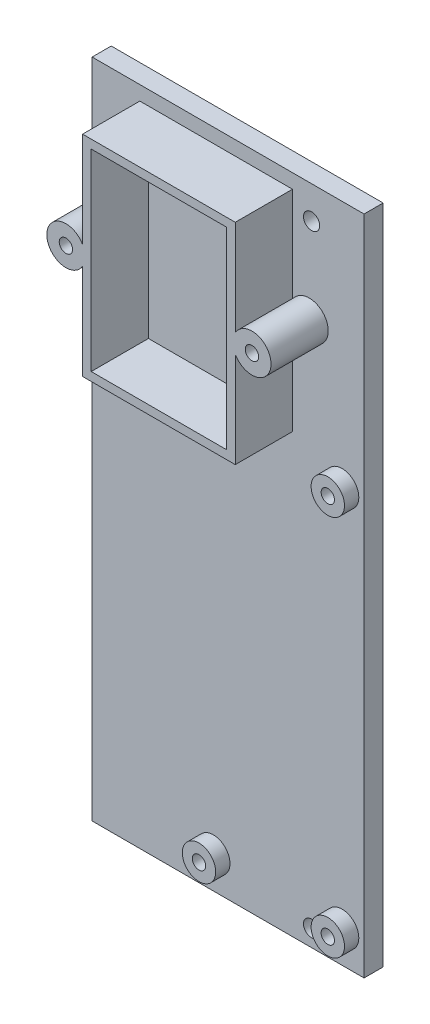
ISO-10303-21;
HEADER;
FILE_DESCRIPTION(('STEP AP214'),'2;1');
FILE_NAME('part.step','',(''),(''),'','','');
FILE_SCHEMA(('AUTOMOTIVE_DESIGN { 1 0 10303 214 1 1 1 1 }'));
ENDSEC;
DATA;
#1=APPLICATION_CONTEXT('core data for automotive mechanical design processes');
#2=APPLICATION_PROTOCOL_DEFINITION('international standard','automotive_design',2000,#1);
#3=PRODUCT_CONTEXT('',#1,'mechanical');
#4=PRODUCT('Part','Part','',(#3));
#5=PRODUCT_RELATED_PRODUCT_CATEGORY('part','',(#4));
#6=PRODUCT_DEFINITION_FORMATION('','',#4);
#7=PRODUCT_DEFINITION_CONTEXT('part definition',#1,'design');
#8=PRODUCT_DEFINITION('design','',#6,#7);
#9=PRODUCT_DEFINITION_SHAPE('','',#8);
#10=(LENGTH_UNIT() NAMED_UNIT(*) SI_UNIT(.MILLI.,.METRE.));
#11=(NAMED_UNIT(*) PLANE_ANGLE_UNIT() SI_UNIT($,.RADIAN.));
#12=(NAMED_UNIT(*) SI_UNIT($,.STERADIAN.) SOLID_ANGLE_UNIT());
#13=UNCERTAINTY_MEASURE_WITH_UNIT(LENGTH_MEASURE(1.E-05),#10,'distance_accuracy_value','');
#14=(GEOMETRIC_REPRESENTATION_CONTEXT(3) GLOBAL_UNCERTAINTY_ASSIGNED_CONTEXT((#13)) GLOBAL_UNIT_ASSIGNED_CONTEXT((#10,
#11,#12)) REPRESENTATION_CONTEXT('',''));
#15=CARTESIAN_POINT('',(0.,0.,0.));
#16=DIRECTION('',(0.,0.,1.));
#17=DIRECTION('',(1.,0.,0.));
#18=AXIS2_PLACEMENT_3D('',#15,#16,#17);
#19=CARTESIAN_POINT('',(-158.5,46.,406.9));
#20=DIRECTION('',(0.,0.,1.));
#21=DIRECTION('',(1.,0.,0.));
#22=AXIS2_PLACEMENT_3D('',#19,#20,#21);
#23=PLANE('',#22);
#24=CARTESIAN_POINT('',(-158.5,46.,406.9));
#25=DIRECTION('',(0.,0.,1.));
#26=DIRECTION('',(1.,0.,0.));
#27=AXIS2_PLACEMENT_3D('',#24,#25,#26);
#28=CIRCLE('',#27,1.4);
#29=CARTESIAN_POINT('',(-157.1,46.,406.9));
#30=VERTEX_POINT('',#29);
#31=EDGE_CURVE('E9',#30,#30,#28,.T.);
#32=ORIENTED_EDGE('',*,*,#31,.T.);
#33=EDGE_LOOP('',(#32));
#34=FACE_BOUND('',#33,.T.);
#35=ADVANCED_FACE('F14',(#34),#23,.T.);
#36=CARTESIAN_POINT('',(-192.2,25.8,403.));
#37=DIRECTION('',(0.,0.,1.));
#38=DIRECTION('',(1.,0.,0.));
#39=AXIS2_PLACEMENT_3D('',#36,#37,#38);
#40=PLANE('',#39);
#41=DIRECTION('',(0.,1.,0.));
#42=VECTOR('',#41,1.);
#43=CARTESIAN_POINT('',(-192.2,25.8,403.));
#44=LINE('',#43,#42);
#45=CARTESIAN_POINT('',(-192.2,25.8,403.));
#46=VERTEX_POINT('',#45);
#47=CARTESIAN_POINT('',(-192.2,66.2,403.));
#48=VERTEX_POINT('',#47);
#49=EDGE_CURVE('E352',#46,#48,#44,.T.);
#50=ORIENTED_EDGE('',*,*,#49,.F.);
#51=DIRECTION('',(1.,0.,0.));
#52=VECTOR('',#51,1.);
#53=CARTESIAN_POINT('',(-192.2,25.8,403.));
#54=LINE('',#53,#52);
#55=CARTESIAN_POINT('',(-163.8,25.8,403.));
#56=VERTEX_POINT('',#55);
#57=EDGE_CURVE('E378',#46,#56,#54,.T.);
#58=ORIENTED_EDGE('',*,*,#57,.T.);
#59=DIRECTION('',(0.,1.,0.));
#60=VECTOR('',#59,1.);
#61=CARTESIAN_POINT('',(-163.8,25.8,403.));
#62=LINE('',#61,#60);
#63=CARTESIAN_POINT('',(-163.8,66.2,403.));
#64=VERTEX_POINT('',#63);
#65=EDGE_CURVE('E343',#56,#64,#62,.T.);
#66=ORIENTED_EDGE('',*,*,#65,.T.);
#67=DIRECTION('',(1.,0.,0.));
#68=VECTOR('',#67,1.);
#69=CARTESIAN_POINT('',(-192.2,66.2,403.));
#70=LINE('',#69,#68);
#71=EDGE_CURVE('E351',#48,#64,#70,.T.);
#72=ORIENTED_EDGE('',*,*,#71,.F.);
#73=EDGE_LOOP('',(#50,#58,#66,#72));
#74=FACE_BOUND('',#73,.T.);
#75=ADVANCED_FACE('F604',(#74),#40,.T.);
#76=CARTESIAN_POINT('',(-197.5,46.,406.9));
#77=DIRECTION('',(0.,0.,1.));
#78=DIRECTION('',(1.,0.,0.));
#79=AXIS2_PLACEMENT_3D('',#76,#77,#78);
#80=PLANE('',#79);
#81=CARTESIAN_POINT('',(-197.5,46.,406.9));
#82=DIRECTION('',(0.,0.,1.));
#83=DIRECTION('',(1.,0.,0.));
#84=AXIS2_PLACEMENT_3D('',#81,#82,#83);
#85=CIRCLE('',#84,1.4);
#86=CARTESIAN_POINT('',(-196.1,46.,406.9));
#87=VERTEX_POINT('',#86);
#88=EDGE_CURVE('E391',#87,#87,#85,.T.);
#89=ORIENTED_EDGE('',*,*,#88,.T.);
#90=EDGE_LOOP('',(#89));
#91=FACE_BOUND('',#90,.T.);
#92=ADVANCED_FACE('F609',(#91),#80,.T.);
#93=CARTESIAN_POINT('',(-158.5,46.,406.9));
#94=DIRECTION('',(0.,0.,1.));
#95=DIRECTION('',(1.,0.,0.));
#96=AXIS2_PLACEMENT_3D('',#93,#94,#95);
#97=CYLINDRICAL_SURFACE('',#96,1.4);
#98=DIRECTION('',(0.,0.,1.));
#99=VECTOR('',#98,1.);
#100=CARTESIAN_POINT('',(-157.1,46.,406.9));
#101=LINE('',#100,#99);
#102=CARTESIAN_POINT('',(-157.1,46.,415.));
#103=VERTEX_POINT('',#102);
#104=EDGE_CURVE('E25',#30,#103,#101,.T.);
#105=ORIENTED_EDGE('',*,*,#104,.F.);
#106=ORIENTED_EDGE('',*,*,#31,.F.);
#107=ORIENTED_EDGE('',*,*,#104,.T.);
#108=CARTESIAN_POINT('',(-158.5,46.,415.));
#109=DIRECTION('',(0.,0.,1.));
#110=DIRECTION('',(1.,0.,0.));
#111=AXIS2_PLACEMENT_3D('',#108,#109,#110);
#112=CIRCLE('',#111,1.4);
#113=EDGE_CURVE('E316',#103,#103,#112,.T.);
#114=ORIENTED_EDGE('',*,*,#113,.T.);
#115=EDGE_LOOP('',(#105,#106,#107,#114));
#116=FACE_BOUND('',#115,.T.);
#117=ADVANCED_FACE('F654',(#116),#97,.F.);
#118=CARTESIAN_POINT('',(-192.2,66.2,403.));
#119=DIRECTION('',(0.,1.,0.));
#120=DIRECTION('',(1.,0.,0.));
#121=AXIS2_PLACEMENT_3D('',#118,#119,#120);
#122=PLANE('',#121);
#123=DIRECTION('',(-1.,0.,0.));
#124=VECTOR('',#123,1.);
#125=CARTESIAN_POINT('',(-193.1,66.2,415.));
#126=LINE('',#125,#124);
#127=CARTESIAN_POINT('',(-163.8,66.2,415.));
#128=VERTEX_POINT('',#127);
#129=CARTESIAN_POINT('',(-192.2,66.2,415.));
#130=VERTEX_POINT('',#129);
#131=EDGE_CURVE('E317',#128,#130,#126,.T.);
#132=ORIENTED_EDGE('',*,*,#131,.T.);
#133=DIRECTION('',(0.,0.,1.));
#134=VECTOR('',#133,1.);
#135=CARTESIAN_POINT('',(-192.2,66.2,403.));
#136=LINE('',#135,#134);
#137=EDGE_CURVE('E348',#48,#130,#136,.T.);
#138=ORIENTED_EDGE('',*,*,#137,.F.);
#139=ORIENTED_EDGE('',*,*,#71,.T.);
#140=DIRECTION('',(0.,0.,1.));
#141=VECTOR('',#140,1.);
#142=CARTESIAN_POINT('',(-163.8,66.2,403.));
#143=LINE('',#142,#141);
#144=EDGE_CURVE('E340',#64,#128,#143,.T.);
#145=ORIENTED_EDGE('',*,*,#144,.T.);
#146=EDGE_LOOP('',(#132,#138,#139,#145));
#147=FACE_BOUND('',#146,.T.);
#148=ADVANCED_FACE('F650',(#147),#122,.F.);
#149=CARTESIAN_POINT('',(-192.2,25.8,403.));
#150=DIRECTION('',(1.,0.,0.));
#151=DIRECTION('',(0.,1.,0.));
#152=AXIS2_PLACEMENT_3D('',#149,#150,#151);
#153=PLANE('',#152);
#154=DIRECTION('',(0.,0.,1.));
#155=VECTOR('',#154,1.);
#156=CARTESIAN_POINT('',(-192.2,25.8,403.));
#157=LINE('',#156,#155);
#158=CARTESIAN_POINT('',(-192.2,25.8,415.));
#159=VERTEX_POINT('',#158);
#160=EDGE_CURVE('E344',#46,#159,#157,.T.);
#161=ORIENTED_EDGE('',*,*,#160,.F.);
#162=ORIENTED_EDGE('',*,*,#49,.T.);
#163=ORIENTED_EDGE('',*,*,#137,.T.);
#164=DIRECTION('',(0.,1.,0.));
#165=VECTOR('',#164,1.);
#166=CARTESIAN_POINT('',(-192.2,24.9,415.));
#167=LINE('',#166,#165);
#168=EDGE_CURVE('E390',#159,#130,#167,.T.);
#169=ORIENTED_EDGE('',*,*,#168,.F.);
#170=EDGE_LOOP('',(#161,#162,#163,#169));
#171=FACE_BOUND('',#170,.T.);
#172=ADVANCED_FACE('F653',(#171),#153,.T.);
#173=CARTESIAN_POINT('',(-163.8,25.8,403.));
#174=DIRECTION('',(1.,0.,0.));
#175=DIRECTION('',(0.,1.,0.));
#176=AXIS2_PLACEMENT_3D('',#173,#174,#175);
#177=PLANE('',#176);
#178=DIRECTION('',(0.,1.,0.));
#179=VECTOR('',#178,1.);
#180=CARTESIAN_POINT('',(-163.8,24.9,415.));
#181=LINE('',#180,#179);
#182=CARTESIAN_POINT('',(-163.8,25.8,415.));
#183=VERTEX_POINT('',#182);
#184=EDGE_CURVE('E312',#183,#128,#181,.T.);
#185=ORIENTED_EDGE('',*,*,#184,.T.);
#186=ORIENTED_EDGE('',*,*,#144,.F.);
#187=ORIENTED_EDGE('',*,*,#65,.F.);
#188=DIRECTION('',(0.,0.,1.));
#189=VECTOR('',#188,1.);
#190=CARTESIAN_POINT('',(-163.8,25.8,403.));
#191=LINE('',#190,#189);
#192=EDGE_CURVE('E381',#56,#183,#191,.T.);
#193=ORIENTED_EDGE('',*,*,#192,.T.);
#194=EDGE_LOOP('',(#185,#186,#187,#193));
#195=FACE_BOUND('',#194,.T.);
#196=ADVANCED_FACE('F658',(#195),#177,.F.);
#197=CARTESIAN_POINT('',(-192.2,25.8,403.));
#198=DIRECTION('',(0.,1.,0.));
#199=DIRECTION('',(1.,0.,0.));
#200=AXIS2_PLACEMENT_3D('',#197,#198,#199);
#201=PLANE('',#200);
#202=ORIENTED_EDGE('',*,*,#192,.F.);
#203=ORIENTED_EDGE('',*,*,#57,.F.);
#204=ORIENTED_EDGE('',*,*,#160,.T.);
#205=DIRECTION('',(-1.,0.,0.));
#206=VECTOR('',#205,1.);
#207=CARTESIAN_POINT('',(-193.1,25.8,415.));
#208=LINE('',#207,#206);
#209=EDGE_CURVE('E303',#183,#159,#208,.T.);
#210=ORIENTED_EDGE('',*,*,#209,.F.);
#211=EDGE_LOOP('',(#202,#203,#204,#210));
#212=FACE_BOUND('',#211,.T.);
#213=ADVANCED_FACE('F656',(#212),#201,.T.);
#214=CARTESIAN_POINT('',(-197.5,46.,406.9));
#215=DIRECTION('',(0.,0.,1.));
#216=DIRECTION('',(1.,0.,0.));
#217=AXIS2_PLACEMENT_3D('',#214,#215,#216);
#218=CYLINDRICAL_SURFACE('',#217,1.4);
#219=DIRECTION('',(0.,0.,1.));
#220=VECTOR('',#219,1.);
#221=CARTESIAN_POINT('',(-196.1,46.,406.9));
#222=LINE('',#221,#220);
#223=CARTESIAN_POINT('',(-196.1,46.,415.));
#224=VERTEX_POINT('',#223);
#225=EDGE_CURVE('E394',#87,#224,#222,.T.);
#226=ORIENTED_EDGE('',*,*,#225,.F.);
#227=ORIENTED_EDGE('',*,*,#88,.F.);
#228=ORIENTED_EDGE('',*,*,#225,.T.);
#229=CARTESIAN_POINT('',(-197.5,46.,415.));
#230=DIRECTION('',(0.,0.,1.));
#231=DIRECTION('',(1.,0.,0.));
#232=AXIS2_PLACEMENT_3D('',#229,#230,#231);
#233=CIRCLE('',#232,1.4);
#234=EDGE_CURVE('E300',#224,#224,#233,.T.);
#235=ORIENTED_EDGE('',*,*,#234,.T.);
#236=EDGE_LOOP('',(#226,#227,#228,#235));
#237=FACE_BOUND('',#236,.T.);
#238=ADVANCED_FACE('F642',(#237),#218,.F.);
#239=CARTESIAN_POINT('',(-151.6,19.,406.));
#240=DIRECTION('',(0.,0.,1.));
#241=DIRECTION('',(1.,0.,0.));
#242=AXIS2_PLACEMENT_3D('',#239,#240,#241);
#243=PLANE('',#242);
#244=CARTESIAN_POINT('',(-151.6,19.,406.));
#245=DIRECTION('',(0.,0.,1.));
#246=DIRECTION('',(1.,0.,0.));
#247=AXIS2_PLACEMENT_3D('',#244,#245,#246);
#248=CIRCLE('',#247,1.4);
#249=CARTESIAN_POINT('',(-150.2,19.,406.));
#250=VERTEX_POINT('',#249);
#251=EDGE_CURVE('E304',#250,#250,#248,.T.);
#252=ORIENTED_EDGE('',*,*,#251,.F.);
#253=EDGE_LOOP('',(#252));
#254=FACE_BOUND('',#253,.T.);
#255=CARTESIAN_POINT('',(-151.6,19.,406.));
#256=DIRECTION('',(0.,0.,1.));
#257=DIRECTION('',(1.,0.,0.));
#258=AXIS2_PLACEMENT_3D('',#255,#256,#257);
#259=CIRCLE('',#258,3.5);
#260=CARTESIAN_POINT('',(-148.1,19.,406.));
#261=VERTEX_POINT('',#260);
#262=EDGE_CURVE('E231',#261,#261,#259,.T.);
#263=ORIENTED_EDGE('',*,*,#262,.T.);
#264=EDGE_LOOP('',(#263));
#265=FACE_BOUND('',#264,.T.);
#266=ADVANCED_FACE('F665',(#254,#265),#243,.T.);
#267=CARTESIAN_POINT('',(-194.,24.,415.));
#268=DIRECTION('',(0.,0.,1.));
#269=DIRECTION('',(1.,0.,0.));
#270=AXIS2_PLACEMENT_3D('',#267,#268,#269);
#271=PLANE('',#270);
#272=ORIENTED_EDGE('',*,*,#113,.F.);
#273=EDGE_LOOP('',(#272));
#274=FACE_BOUND('',#273,.T.);
#275=ORIENTED_EDGE('',*,*,#209,.T.);
#276=ORIENTED_EDGE('',*,*,#168,.T.);
#277=ORIENTED_EDGE('',*,*,#131,.F.);
#278=ORIENTED_EDGE('',*,*,#184,.F.);
#279=EDGE_LOOP('',(#275,#276,#277,#278));
#280=FACE_BOUND('',#279,.T.);
#281=ORIENTED_EDGE('',*,*,#234,.F.);
#282=EDGE_LOOP('',(#281));
#283=FACE_BOUND('',#282,.T.);
#284=DIRECTION('',(0.,1.,0.));
#285=VECTOR('',#284,1.);
#286=CARTESIAN_POINT('',(-194.,24.,415.));
#287=LINE('',#286,#285);
#288=CARTESIAN_POINT('',(-194.,24.,415.));
#289=VERTEX_POINT('',#288);
#290=CARTESIAN_POINT('',(-194.,44.063508326896,415.));
#291=VERTEX_POINT('',#290);
#292=EDGE_CURVE('E338',#289,#291,#287,.T.);
#293=ORIENTED_EDGE('',*,*,#292,.F.);
#294=DIRECTION('',(1.,0.,0.));
#295=VECTOR('',#294,1.);
#296=CARTESIAN_POINT('',(-194.,24.,415.));
#297=LINE('',#296,#295);
#298=CARTESIAN_POINT('',(-162.,24.,415.));
#299=VERTEX_POINT('',#298);
#300=EDGE_CURVE('E339',#289,#299,#297,.T.);
#301=ORIENTED_EDGE('',*,*,#300,.T.);
#302=DIRECTION('',(0.,1.,0.));
#303=VECTOR('',#302,1.);
#304=CARTESIAN_POINT('',(-162.,24.,415.));
#305=LINE('',#304,#303);
#306=CARTESIAN_POINT('',(-162.,44.063508326896,415.));
#307=VERTEX_POINT('',#306);
#308=EDGE_CURVE('E377',#299,#307,#305,.T.);
#309=ORIENTED_EDGE('',*,*,#308,.T.);
#310=CARTESIAN_POINT('',(-158.5,46.,415.));
#311=DIRECTION('',(0.,0.,-1.));
#312=DIRECTION('',(-0.874999999999969,0.484122918275983,0.));
#313=AXIS2_PLACEMENT_3D('',#310,#311,#312);
#314=CIRCLE('',#313,4.);
#315=CARTESIAN_POINT('',(-162.,47.936491673104,415.));
#316=VERTEX_POINT('',#315);
#317=EDGE_CURVE('E268',#316,#307,#314,.T.);
#318=ORIENTED_EDGE('',*,*,#317,.F.);
#319=DIRECTION('',(0.,1.,0.));
#320=VECTOR('',#319,1.);
#321=CARTESIAN_POINT('',(-162.,24.,415.));
#322=LINE('',#321,#320);
#323=CARTESIAN_POINT('',(-162.,68.,415.));
#324=VERTEX_POINT('',#323);
#325=EDGE_CURVE('E265',#316,#324,#322,.T.);
#326=ORIENTED_EDGE('',*,*,#325,.T.);
#327=DIRECTION('',(1.,0.,0.));
#328=VECTOR('',#327,1.);
#329=CARTESIAN_POINT('',(-194.,68.,415.));
#330=LINE('',#329,#328);
#331=CARTESIAN_POINT('',(-194.,68.,415.));
#332=VERTEX_POINT('',#331);
#333=EDGE_CURVE('E76',#332,#324,#330,.T.);
#334=ORIENTED_EDGE('',*,*,#333,.F.);
#335=DIRECTION('',(0.,1.,0.));
#336=VECTOR('',#335,1.);
#337=CARTESIAN_POINT('',(-194.,24.,415.));
#338=LINE('',#337,#336);
#339=CARTESIAN_POINT('',(-194.,47.936491673104,415.));
#340=VERTEX_POINT('',#339);
#341=EDGE_CURVE('E86',#340,#332,#338,.T.);
#342=ORIENTED_EDGE('',*,*,#341,.F.);
#343=CARTESIAN_POINT('',(-197.5,46.,415.));
#344=DIRECTION('',(0.,0.,1.));
#345=DIRECTION('',(1.,0.,0.));
#346=AXIS2_PLACEMENT_3D('',#343,#344,#345);
#347=CIRCLE('',#346,4.);
#348=EDGE_CURVE('E333',#340,#291,#347,.T.);
#349=ORIENTED_EDGE('',*,*,#348,.T.);
#350=EDGE_LOOP('',(#293,#301,#309,#318,#326,#334,#342,#349));
#351=FACE_BOUND('',#350,.T.);
#352=ADVANCED_FACE('F580',(#274,#280,#283,#351),#271,.T.);
#353=CARTESIAN_POINT('',(-178.6,19.,406.));
#354=DIRECTION('',(0.,0.,1.));
#355=DIRECTION('',(1.,0.,0.));
#356=AXIS2_PLACEMENT_3D('',#353,#354,#355);
#357=PLANE('',#356);
#358=CARTESIAN_POINT('',(-178.6,19.,406.));
#359=DIRECTION('',(0.,0.,1.));
#360=DIRECTION('',(1.,0.,0.));
#361=AXIS2_PLACEMENT_3D('',#358,#359,#360);
#362=CIRCLE('',#361,1.4);
#363=CARTESIAN_POINT('',(-177.2,19.,406.));
#364=VERTEX_POINT('',#363);
#365=EDGE_CURVE('E358',#364,#364,#362,.T.);
#366=ORIENTED_EDGE('',*,*,#365,.F.);
#367=EDGE_LOOP('',(#366));
#368=FACE_BOUND('',#367,.T.);
#369=CARTESIAN_POINT('',(-178.6,19.,406.));
#370=DIRECTION('',(0.,0.,1.));
#371=DIRECTION('',(1.,0.,0.));
#372=AXIS2_PLACEMENT_3D('',#369,#370,#371);
#373=CIRCLE('',#372,3.5);
#374=CARTESIAN_POINT('',(-175.1,19.,406.));
#375=VERTEX_POINT('',#374);
#376=EDGE_CURVE('E291',#375,#375,#373,.T.);
#377=ORIENTED_EDGE('',*,*,#376,.T.);
#378=EDGE_LOOP('',(#377));
#379=FACE_BOUND('',#378,.T.);
#380=ADVANCED_FACE('F16',(#368,#379),#357,.T.);
#381=CARTESIAN_POINT('',(-151.6,-61.,406.));
#382=DIRECTION('',(0.,0.,1.));
#383=DIRECTION('',(1.,0.,0.));
#384=AXIS2_PLACEMENT_3D('',#381,#382,#383);
#385=PLANE('',#384);
#386=CARTESIAN_POINT('',(-151.6,-61.,406.));
#387=DIRECTION('',(0.,0.,1.));
#388=DIRECTION('',(1.,0.,0.));
#389=AXIS2_PLACEMENT_3D('',#386,#387,#388);
#390=CIRCLE('',#389,1.4);
#391=CARTESIAN_POINT('',(-150.2,-61.,406.));
#392=VERTEX_POINT('',#391);
#393=EDGE_CURVE('E367',#392,#392,#390,.T.);
#394=ORIENTED_EDGE('',*,*,#393,.F.);
#395=EDGE_LOOP('',(#394));
#396=FACE_BOUND('',#395,.T.);
#397=CARTESIAN_POINT('',(-151.6,-61.,406.));
#398=DIRECTION('',(0.,0.,1.));
#399=DIRECTION('',(1.,0.,0.));
#400=AXIS2_PLACEMENT_3D('',#397,#398,#399);
#401=CIRCLE('',#400,3.5);
#402=CARTESIAN_POINT('',(-148.1,-61.,406.));
#403=VERTEX_POINT('',#402);
#404=EDGE_CURVE('E260',#403,#403,#401,.T.);
#405=ORIENTED_EDGE('',*,*,#404,.T.);
#406=EDGE_LOOP('',(#405));
#407=FACE_BOUND('',#406,.T.);
#408=ADVANCED_FACE('F614',(#396,#407),#385,.T.);
#409=CARTESIAN_POINT('',(-178.6,-61.,406.));
#410=DIRECTION('',(0.,0.,1.));
#411=DIRECTION('',(1.,0.,0.));
#412=AXIS2_PLACEMENT_3D('',#409,#410,#411);
#413=PLANE('',#412);
#414=CARTESIAN_POINT('',(-178.6,-61.,406.));
#415=DIRECTION('',(0.,0.,1.));
#416=DIRECTION('',(1.,0.,0.));
#417=AXIS2_PLACEMENT_3D('',#414,#415,#416);
#418=CIRCLE('',#417,1.4);
#419=CARTESIAN_POINT('',(-177.2,-61.,406.));
#420=VERTEX_POINT('',#419);
#421=EDGE_CURVE('E238',#420,#420,#418,.T.);
#422=ORIENTED_EDGE('',*,*,#421,.F.);
#423=EDGE_LOOP('',(#422));
#424=FACE_BOUND('',#423,.T.);
#425=CARTESIAN_POINT('',(-178.6,-61.,406.));
#426=DIRECTION('',(0.,0.,1.));
#427=DIRECTION('',(1.,0.,0.));
#428=AXIS2_PLACEMENT_3D('',#425,#426,#427);
#429=CIRCLE('',#428,3.5);
#430=CARTESIAN_POINT('',(-175.1,-61.,406.));
#431=VERTEX_POINT('',#430);
#432=EDGE_CURVE('E274',#431,#431,#429,.T.);
#433=ORIENTED_EDGE('',*,*,#432,.T.);
#434=EDGE_LOOP('',(#433));
#435=FACE_BOUND('',#434,.T.);
#436=ADVANCED_FACE('F786',(#424,#435),#413,.T.);
#437=CARTESIAN_POINT('',(-151.6,19.,398.9));
#438=DIRECTION('',(0.,0.,1.));
#439=DIRECTION('',(1.,0.,0.));
#440=AXIS2_PLACEMENT_3D('',#437,#438,#439);
#441=CYLINDRICAL_SURFACE('',#440,1.4);
#442=DIRECTION('',(0.,0.,1.));
#443=VECTOR('',#442,1.);
#444=CARTESIAN_POINT('',(-150.2,19.,398.9));
#445=LINE('',#444,#443);
#446=CARTESIAN_POINT('',(-150.2,19.,399.));
#447=VERTEX_POINT('',#446);
#448=EDGE_CURVE('E362',#447,#250,#445,.T.);
#449=ORIENTED_EDGE('',*,*,#448,.F.);
#450=CARTESIAN_POINT('',(-151.6,19.,399.));
#451=DIRECTION('',(0.,0.,1.));
#452=DIRECTION('',(1.,0.,0.));
#453=AXIS2_PLACEMENT_3D('',#450,#451,#452);
#454=CIRCLE('',#453,1.4);
#455=EDGE_CURVE('E292',#447,#447,#454,.T.);
#456=ORIENTED_EDGE('',*,*,#455,.F.);
#457=ORIENTED_EDGE('',*,*,#448,.T.);
#458=ORIENTED_EDGE('',*,*,#251,.T.);
#459=EDGE_LOOP('',(#449,#456,#457,#458));
#460=FACE_BOUND('',#459,.T.);
#461=ADVANCED_FACE('F648',(#460),#441,.F.);
#462=CARTESIAN_POINT('',(-178.6,19.,398.9));
#463=DIRECTION('',(0.,0.,1.));
#464=DIRECTION('',(1.,0.,0.));
#465=AXIS2_PLACEMENT_3D('',#462,#463,#464);
#466=CYLINDRICAL_SURFACE('',#465,1.4);
#467=DIRECTION('',(0.,0.,1.));
#468=VECTOR('',#467,1.);
#469=CARTESIAN_POINT('',(-177.2,19.,398.9));
#470=LINE('',#469,#468);
#471=CARTESIAN_POINT('',(-177.2,19.,399.));
#472=VERTEX_POINT('',#471);
#473=EDGE_CURVE('E363',#472,#364,#470,.T.);
#474=ORIENTED_EDGE('',*,*,#473,.F.);
#475=CARTESIAN_POINT('',(-178.6,19.,399.));
#476=DIRECTION('',(0.,0.,1.));
#477=DIRECTION('',(1.,0.,0.));
#478=AXIS2_PLACEMENT_3D('',#475,#476,#477);
#479=CIRCLE('',#478,1.4);
#480=EDGE_CURVE('E296',#472,#472,#479,.T.);
#481=ORIENTED_EDGE('',*,*,#480,.F.);
#482=ORIENTED_EDGE('',*,*,#473,.T.);
#483=ORIENTED_EDGE('',*,*,#365,.T.);
#484=EDGE_LOOP('',(#474,#481,#482,#483));
#485=FACE_BOUND('',#484,.T.);
#486=ADVANCED_FACE('F637',(#485),#466,.F.);
#487=CARTESIAN_POINT('',(-151.6,-61.,398.9));
#488=DIRECTION('',(0.,0.,1.));
#489=DIRECTION('',(1.,0.,0.));
#490=AXIS2_PLACEMENT_3D('',#487,#488,#489);
#491=CYLINDRICAL_SURFACE('',#490,1.4);
#492=DIRECTION('',(0.,0.,1.));
#493=VECTOR('',#492,1.);
#494=CARTESIAN_POINT('',(-150.2,-61.,398.9));
#495=LINE('',#494,#493);
#496=CARTESIAN_POINT('',(-150.2,-61.,399.));
#497=VERTEX_POINT('',#496);
#498=EDGE_CURVE('E299',#497,#392,#495,.T.);
#499=ORIENTED_EDGE('',*,*,#498,.F.);
#500=CARTESIAN_POINT('',(-151.6,-61.,399.));
#501=DIRECTION('',(0.,0.,1.));
#502=DIRECTION('',(1.,0.,0.));
#503=AXIS2_PLACEMENT_3D('',#500,#501,#502);
#504=CIRCLE('',#503,1.4);
#505=EDGE_CURVE('E245',#497,#497,#504,.T.);
#506=ORIENTED_EDGE('',*,*,#505,.F.);
#507=ORIENTED_EDGE('',*,*,#498,.T.);
#508=ORIENTED_EDGE('',*,*,#393,.T.);
#509=EDGE_LOOP('',(#499,#506,#507,#508));
#510=FACE_BOUND('',#509,.T.);
#511=ADVANCED_FACE('F631',(#510),#491,.F.);
#512=CARTESIAN_POINT('',(-178.6,-61.,398.9));
#513=DIRECTION('',(0.,0.,1.));
#514=DIRECTION('',(1.,0.,0.));
#515=AXIS2_PLACEMENT_3D('',#512,#513,#514);
#516=CYLINDRICAL_SURFACE('',#515,1.4);
#517=DIRECTION('',(0.,0.,1.));
#518=VECTOR('',#517,1.);
#519=CARTESIAN_POINT('',(-177.2,-61.,398.9));
#520=LINE('',#519,#518);
#521=CARTESIAN_POINT('',(-177.2,-61.,399.));
#522=VERTEX_POINT('',#521);
#523=EDGE_CURVE('E230',#522,#420,#520,.T.);
#524=ORIENTED_EDGE('',*,*,#523,.F.);
#525=CARTESIAN_POINT('',(-178.6,-61.,399.));
#526=DIRECTION('',(0.,0.,1.));
#527=DIRECTION('',(1.,0.,0.));
#528=AXIS2_PLACEMENT_3D('',#525,#526,#527);
#529=CIRCLE('',#528,1.4);
#530=EDGE_CURVE('E285',#522,#522,#529,.T.);
#531=ORIENTED_EDGE('',*,*,#530,.F.);
#532=ORIENTED_EDGE('',*,*,#523,.T.);
#533=ORIENTED_EDGE('',*,*,#421,.T.);
#534=EDGE_LOOP('',(#524,#531,#532,#533));
#535=FACE_BOUND('',#534,.T.);
#536=ADVANCED_FACE('F625',(#535),#516,.F.);
#537=CARTESIAN_POINT('',(-158.,64.2,398.9));
#538=DIRECTION('',(0.,0.,1.));
#539=DIRECTION('',(1.,0.,0.));
#540=AXIS2_PLACEMENT_3D('',#537,#538,#539);
#541=CYLINDRICAL_SURFACE('',#540,1.7);
#542=DIRECTION('',(0.,0.,1.));
#543=VECTOR('',#542,1.);
#544=CARTESIAN_POINT('',(-156.3,64.2,398.9));
#545=LINE('',#544,#543);
#546=CARTESIAN_POINT('',(-156.3,64.2,399.));
#547=VERTEX_POINT('',#546);
#548=CARTESIAN_POINT('',(-156.3,64.2,403.));
#549=VERTEX_POINT('',#548);
#550=EDGE_CURVE('E223',#547,#549,#545,.T.);
#551=ORIENTED_EDGE('',*,*,#550,.F.);
#552=CARTESIAN_POINT('',(-158.,64.2,399.));
#553=DIRECTION('',(0.,0.,1.));
#554=DIRECTION('',(1.,0.,0.));
#555=AXIS2_PLACEMENT_3D('',#552,#553,#554);
#556=CIRCLE('',#555,1.7);
#557=EDGE_CURVE('E228',#547,#547,#556,.T.);
#558=ORIENTED_EDGE('',*,*,#557,.F.);
#559=ORIENTED_EDGE('',*,*,#550,.T.);
#560=CARTESIAN_POINT('',(-158.,64.2,403.));
#561=DIRECTION('',(0.,0.,1.));
#562=DIRECTION('',(1.,0.,0.));
#563=AXIS2_PLACEMENT_3D('',#560,#561,#562);
#564=CIRCLE('',#563,1.7);
#565=EDGE_CURVE('E226',#549,#549,#564,.T.);
#566=ORIENTED_EDGE('',*,*,#565,.T.);
#567=EDGE_LOOP('',(#551,#558,#559,#566));
#568=FACE_BOUND('',#567,.T.);
#569=ADVANCED_FACE('F224',(#568),#541,.F.);
#570=CARTESIAN_POINT('',(-151.6,19.,402.5));
#571=DIRECTION('',(0.,0.,1.));
#572=DIRECTION('',(1.,0.,0.));
#573=AXIS2_PLACEMENT_3D('',#570,#571,#572);
#574=CYLINDRICAL_SURFACE('',#573,3.5);
#575=DIRECTION('',(0.,0.,1.));
#576=VECTOR('',#575,1.);
#577=CARTESIAN_POINT('',(-148.1,19.,402.5));
#578=LINE('',#577,#576);
#579=CARTESIAN_POINT('',(-148.1,19.,403.));
#580=VERTEX_POINT('',#579);
#581=EDGE_CURVE('E241',#580,#261,#578,.T.);
#582=ORIENTED_EDGE('',*,*,#581,.T.);
#583=ORIENTED_EDGE('',*,*,#262,.F.);
#584=ORIENTED_EDGE('',*,*,#581,.F.);
#585=CARTESIAN_POINT('',(-151.6,19.,403.));
#586=DIRECTION('',(0.,0.,1.));
#587=DIRECTION('',(1.,0.,0.));
#588=AXIS2_PLACEMENT_3D('',#585,#586,#587);
#589=CIRCLE('',#588,3.5);
#590=EDGE_CURVE('E18',#580,#580,#589,.T.);
#591=ORIENTED_EDGE('',*,*,#590,.T.);
#592=EDGE_LOOP('',(#582,#583,#584,#591));
#593=FACE_BOUND('',#592,.T.);
#594=ADVANCED_FACE('F624',(#593),#574,.T.);
#595=CARTESIAN_POINT('',(-158.5,46.,402.5));
#596=DIRECTION('',(0.,0.,1.));
#597=DIRECTION('',(1.,0.,0.));
#598=AXIS2_PLACEMENT_3D('',#595,#596,#597);
#599=CYLINDRICAL_SURFACE('',#598,4.);
#600=CARTESIAN_POINT('',(-158.5,46.,403.));
#601=DIRECTION('',(0.,0.,-1.));
#602=DIRECTION('',(-0.874999999999969,0.484122918275983,0.));
#603=AXIS2_PLACEMENT_3D('',#600,#601,#602);
#604=CIRCLE('',#603,4.);
#605=CARTESIAN_POINT('',(-162.,47.936491673104,403.));
#606=VERTEX_POINT('',#605);
#607=CARTESIAN_POINT('',(-162.,44.063508326896,403.));
#608=VERTEX_POINT('',#607);
#609=EDGE_CURVE('E326',#606,#608,#604,.T.);
#610=ORIENTED_EDGE('',*,*,#609,.F.);
#611=DIRECTION('',(0.,0.,1.));
#612=VECTOR('',#611,1.);
#613=CARTESIAN_POINT('',(-162.,47.936491673104,402.5));
#614=LINE('',#613,#612);
#615=EDGE_CURVE('E269',#606,#316,#614,.T.);
#616=ORIENTED_EDGE('',*,*,#615,.T.);
#617=ORIENTED_EDGE('',*,*,#317,.T.);
#618=DIRECTION('',(0.,0.,1.));
#619=VECTOR('',#618,1.);
#620=CARTESIAN_POINT('',(-162.,44.063508326896,402.5));
#621=LINE('',#620,#619);
#622=EDGE_CURVE('E290',#608,#307,#621,.T.);
#623=ORIENTED_EDGE('',*,*,#622,.F.);
#624=EDGE_LOOP('',(#610,#616,#617,#623));
#625=FACE_BOUND('',#624,.T.);
#626=ADVANCED_FACE('F577',(#625),#599,.T.);
#627=CARTESIAN_POINT('',(-162.,24.,402.5));
#628=DIRECTION('',(1.,0.,0.));
#629=DIRECTION('',(0.,1.,0.));
#630=AXIS2_PLACEMENT_3D('',#627,#628,#629);
#631=PLANE('',#630);
#632=ORIENTED_EDGE('',*,*,#615,.F.);
#633=DIRECTION('',(0.,1.,0.));
#634=VECTOR('',#633,1.);
#635=CARTESIAN_POINT('',(-162.,-21.85,403.));
#636=LINE('',#635,#634);
#637=CARTESIAN_POINT('',(-162.,68.,403.));
#638=VERTEX_POINT('',#637);
#639=EDGE_CURVE('E322',#606,#638,#636,.T.);
#640=ORIENTED_EDGE('',*,*,#639,.T.);
#641=DIRECTION('',(0.,0.,1.));
#642=VECTOR('',#641,1.);
#643=CARTESIAN_POINT('',(-162.,68.,402.5));
#644=LINE('',#643,#642);
#645=EDGE_CURVE('E453',#638,#324,#644,.T.);
#646=ORIENTED_EDGE('',*,*,#645,.T.);
#647=ORIENTED_EDGE('',*,*,#325,.F.);
#648=EDGE_LOOP('',(#632,#640,#646,#647));
#649=FACE_BOUND('',#648,.T.);
#650=ADVANCED_FACE('F618',(#649),#631,.T.);
#651=CARTESIAN_POINT('',(-194.,68.,402.5));
#652=DIRECTION('',(0.,1.,0.));
#653=DIRECTION('',(1.,0.,0.));
#654=AXIS2_PLACEMENT_3D('',#651,#652,#653);
#655=PLANE('',#654);
#656=ORIENTED_EDGE('',*,*,#645,.F.);
#657=DIRECTION('',(-1.,0.,0.));
#658=VECTOR('',#657,1.);
#659=CARTESIAN_POINT('',(-199.,68.,403.));
#660=LINE('',#659,#658);
#661=CARTESIAN_POINT('',(-194.,68.,403.));
#662=VERTEX_POINT('',#661);
#663=EDGE_CURVE('E327',#638,#662,#660,.T.);
#664=ORIENTED_EDGE('',*,*,#663,.T.);
#665=DIRECTION('',(0.,0.,1.));
#666=VECTOR('',#665,1.);
#667=CARTESIAN_POINT('',(-194.,68.,402.5));
#668=LINE('',#667,#666);
#669=EDGE_CURVE('E449',#662,#332,#668,.T.);
#670=ORIENTED_EDGE('',*,*,#669,.T.);
#671=ORIENTED_EDGE('',*,*,#333,.T.);
#672=EDGE_LOOP('',(#656,#664,#670,#671));
#673=FACE_BOUND('',#672,.T.);
#674=ADVANCED_FACE('F510',(#673),#655,.T.);
#675=CARTESIAN_POINT('',(-194.,24.,402.5));
#676=DIRECTION('',(1.,0.,0.));
#677=DIRECTION('',(0.,1.,0.));
#678=AXIS2_PLACEMENT_3D('',#675,#676,#677);
#679=PLANE('',#678);
#680=ORIENTED_EDGE('',*,*,#341,.T.);
#681=ORIENTED_EDGE('',*,*,#669,.F.);
#682=DIRECTION('',(0.,1.,0.));
#683=VECTOR('',#682,1.);
#684=CARTESIAN_POINT('',(-194.,-21.85,403.));
#685=LINE('',#684,#683);
#686=CARTESIAN_POINT('',(-194.,47.936491673104,403.));
#687=VERTEX_POINT('',#686);
#688=EDGE_CURVE('E321',#687,#662,#685,.T.);
#689=ORIENTED_EDGE('',*,*,#688,.F.);
#690=DIRECTION('',(0.,0.,1.));
#691=VECTOR('',#690,1.);
#692=CARTESIAN_POINT('',(-194.,47.936491673104,402.5));
#693=LINE('',#692,#691);
#694=EDGE_CURVE('E330',#687,#340,#693,.T.);
#695=ORIENTED_EDGE('',*,*,#694,.T.);
#696=EDGE_LOOP('',(#680,#681,#689,#695));
#697=FACE_BOUND('',#696,.T.);
#698=ADVANCED_FACE('F520',(#697),#679,.F.);
#699=CARTESIAN_POINT('',(-197.5,46.,402.5));
#700=DIRECTION('',(0.,0.,1.));
#701=DIRECTION('',(1.,0.,0.));
#702=AXIS2_PLACEMENT_3D('',#699,#700,#701);
#703=CYLINDRICAL_SURFACE('',#702,4.);
#704=ORIENTED_EDGE('',*,*,#348,.F.);
#705=ORIENTED_EDGE('',*,*,#694,.F.);
#706=CARTESIAN_POINT('',(-197.5,46.,403.));
#707=DIRECTION('',(0.,0.,1.));
#708=DIRECTION('',(1.,0.,0.));
#709=AXIS2_PLACEMENT_3D('',#706,#707,#708);
#710=CIRCLE('',#709,4.);
#711=CARTESIAN_POINT('',(-194.,44.063508326896,403.));
#712=VERTEX_POINT('',#711);
#713=EDGE_CURVE('E255',#687,#712,#710,.T.);
#714=ORIENTED_EDGE('',*,*,#713,.T.);
#715=DIRECTION('',(0.,0.,1.));
#716=VECTOR('',#715,1.);
#717=CARTESIAN_POINT('',(-194.,44.063508326896,402.5));
#718=LINE('',#717,#716);
#719=EDGE_CURVE('E415',#712,#291,#718,.T.);
#720=ORIENTED_EDGE('',*,*,#719,.T.);
#721=EDGE_LOOP('',(#704,#705,#714,#720));
#722=FACE_BOUND('',#721,.T.);
#723=ADVANCED_FACE('F591',(#722),#703,.T.);
#724=CARTESIAN_POINT('',(-194.,24.,402.5));
#725=DIRECTION('',(1.,0.,0.));
#726=DIRECTION('',(0.,1.,0.));
#727=AXIS2_PLACEMENT_3D('',#724,#725,#726);
#728=PLANE('',#727);
#729=ORIENTED_EDGE('',*,*,#292,.T.);
#730=ORIENTED_EDGE('',*,*,#719,.F.);
#731=DIRECTION('',(0.,1.,0.));
#732=VECTOR('',#731,1.);
#733=CARTESIAN_POINT('',(-194.,-21.85,403.));
#734=LINE('',#733,#732);
#735=CARTESIAN_POINT('',(-194.,24.,403.));
#736=VERTEX_POINT('',#735);
#737=EDGE_CURVE('E250',#736,#712,#734,.T.);
#738=ORIENTED_EDGE('',*,*,#737,.F.);
#739=DIRECTION('',(0.,0.,1.));
#740=VECTOR('',#739,1.);
#741=CARTESIAN_POINT('',(-194.,24.,402.5));
#742=LINE('',#741,#740);
#743=EDGE_CURVE('E334',#736,#289,#742,.T.);
#744=ORIENTED_EDGE('',*,*,#743,.T.);
#745=EDGE_LOOP('',(#729,#730,#738,#744));
#746=FACE_BOUND('',#745,.T.);
#747=ADVANCED_FACE('F589',(#746),#728,.F.);
#748=CARTESIAN_POINT('',(-194.,24.,402.5));
#749=DIRECTION('',(0.,1.,0.));
#750=DIRECTION('',(1.,0.,0.));
#751=AXIS2_PLACEMENT_3D('',#748,#749,#750);
#752=PLANE('',#751);
#753=ORIENTED_EDGE('',*,*,#300,.F.);
#754=ORIENTED_EDGE('',*,*,#743,.F.);
#755=DIRECTION('',(-1.,0.,0.));
#756=VECTOR('',#755,1.);
#757=CARTESIAN_POINT('',(-199.,24.,403.));
#758=LINE('',#757,#756);
#759=CARTESIAN_POINT('',(-162.,24.,403.));
#760=VERTEX_POINT('',#759);
#761=EDGE_CURVE('E247',#760,#736,#758,.T.);
#762=ORIENTED_EDGE('',*,*,#761,.F.);
#763=DIRECTION('',(0.,0.,1.));
#764=VECTOR('',#763,1.);
#765=CARTESIAN_POINT('',(-162.,24.,402.5));
#766=LINE('',#765,#764);
#767=EDGE_CURVE('E286',#760,#299,#766,.T.);
#768=ORIENTED_EDGE('',*,*,#767,.T.);
#769=EDGE_LOOP('',(#753,#754,#762,#768));
#770=FACE_BOUND('',#769,.T.);
#771=ADVANCED_FACE('F583',(#770),#752,.F.);
#772=CARTESIAN_POINT('',(-162.,24.,402.5));
#773=DIRECTION('',(1.,0.,0.));
#774=DIRECTION('',(0.,1.,0.));
#775=AXIS2_PLACEMENT_3D('',#772,#773,#774);
#776=PLANE('',#775);
#777=ORIENTED_EDGE('',*,*,#767,.F.);
#778=DIRECTION('',(0.,1.,0.));
#779=VECTOR('',#778,1.);
#780=CARTESIAN_POINT('',(-162.,-21.85,403.));
#781=LINE('',#780,#779);
#782=EDGE_CURVE('E251',#760,#608,#781,.T.);
#783=ORIENTED_EDGE('',*,*,#782,.T.);
#784=ORIENTED_EDGE('',*,*,#622,.T.);
#785=ORIENTED_EDGE('',*,*,#308,.F.);
#786=EDGE_LOOP('',(#777,#783,#784,#785));
#787=FACE_BOUND('',#786,.T.);
#788=ADVANCED_FACE('F572',(#787),#776,.T.);
#789=CARTESIAN_POINT('',(-178.6,19.,402.5));
#790=DIRECTION('',(0.,0.,1.));
#791=DIRECTION('',(1.,0.,0.));
#792=AXIS2_PLACEMENT_3D('',#789,#790,#791);
#793=CYLINDRICAL_SURFACE('',#792,3.5);
#794=DIRECTION('',(0.,0.,1.));
#795=VECTOR('',#794,1.);
#796=CARTESIAN_POINT('',(-175.1,19.,402.5));
#797=LINE('',#796,#795);
#798=CARTESIAN_POINT('',(-175.1,19.,403.));
#799=VERTEX_POINT('',#798);
#800=EDGE_CURVE('E405',#799,#375,#797,.T.);
#801=ORIENTED_EDGE('',*,*,#800,.T.);
#802=ORIENTED_EDGE('',*,*,#376,.F.);
#803=ORIENTED_EDGE('',*,*,#800,.F.);
#804=CARTESIAN_POINT('',(-178.6,19.,403.));
#805=DIRECTION('',(0.,0.,1.));
#806=DIRECTION('',(1.,0.,0.));
#807=AXIS2_PLACEMENT_3D('',#804,#805,#806);
#808=CIRCLE('',#807,3.5);
#809=EDGE_CURVE('E424',#799,#799,#808,.T.);
#810=ORIENTED_EDGE('',*,*,#809,.T.);
#811=EDGE_LOOP('',(#801,#802,#803,#810));
#812=FACE_BOUND('',#811,.T.);
#813=ADVANCED_FACE('F622',(#812),#793,.T.);
#814=CARTESIAN_POINT('',(-151.6,-61.,402.5));
#815=DIRECTION('',(0.,0.,1.));
#816=DIRECTION('',(1.,0.,0.));
#817=AXIS2_PLACEMENT_3D('',#814,#815,#816);
#818=CYLINDRICAL_SURFACE('',#817,3.5);
#819=DIRECTION('',(0.,0.,1.));
#820=VECTOR('',#819,1.);
#821=CARTESIAN_POINT('',(-148.1,-61.,402.5));
#822=LINE('',#821,#820);
#823=CARTESIAN_POINT('',(-148.1,-61.,403.));
#824=VERTEX_POINT('',#823);
#825=EDGE_CURVE('E256',#824,#403,#822,.T.);
#826=ORIENTED_EDGE('',*,*,#825,.T.);
#827=ORIENTED_EDGE('',*,*,#404,.F.);
#828=ORIENTED_EDGE('',*,*,#825,.F.);
#829=CARTESIAN_POINT('',(-151.6,-61.,403.));
#830=DIRECTION('',(0.,0.,1.));
#831=DIRECTION('',(1.,0.,0.));
#832=AXIS2_PLACEMENT_3D('',#829,#830,#831);
#833=CIRCLE('',#832,3.5);
#834=EDGE_CURVE('E402',#824,#824,#833,.T.);
#835=ORIENTED_EDGE('',*,*,#834,.T.);
#836=EDGE_LOOP('',(#826,#827,#828,#835));
#837=FACE_BOUND('',#836,.T.);
#838=ADVANCED_FACE('F674',(#837),#818,.T.);
#839=CARTESIAN_POINT('',(-158.,-64.2,398.9));
#840=DIRECTION('',(0.,0.,1.));
#841=DIRECTION('',(1.,0.,0.));
#842=AXIS2_PLACEMENT_3D('',#839,#840,#841);
#843=CYLINDRICAL_SURFACE('',#842,1.7);
#844=DIRECTION('',(0.,0.,1.));
#845=VECTOR('',#844,1.);
#846=CARTESIAN_POINT('',(-156.3,-64.2,398.9));
#847=LINE('',#846,#845);
#848=CARTESIAN_POINT('',(-156.3,-64.2,399.));
#849=VERTEX_POINT('',#848);
#850=CARTESIAN_POINT('',(-156.3,-64.2,403.));
#851=VERTEX_POINT('',#850);
#852=EDGE_CURVE('E261',#849,#851,#847,.T.);
#853=ORIENTED_EDGE('',*,*,#852,.F.);
#854=CARTESIAN_POINT('',(-158.,-64.2,399.));
#855=DIRECTION('',(0.,0.,1.));
#856=DIRECTION('',(1.,0.,0.));
#857=AXIS2_PLACEMENT_3D('',#854,#855,#856);
#858=CIRCLE('',#857,1.7);
#859=EDGE_CURVE('E281',#849,#849,#858,.T.);
#860=ORIENTED_EDGE('',*,*,#859,.F.);
#861=ORIENTED_EDGE('',*,*,#852,.T.);
#862=CARTESIAN_POINT('',(-158.,-64.2,403.));
#863=DIRECTION('',(0.,0.,1.));
#864=DIRECTION('',(1.,0.,0.));
#865=AXIS2_PLACEMENT_3D('',#862,#863,#864);
#866=CIRCLE('',#865,1.7);
#867=EDGE_CURVE('E398',#851,#851,#866,.T.);
#868=ORIENTED_EDGE('',*,*,#867,.T.);
#869=EDGE_LOOP('',(#853,#860,#861,#868));
#870=FACE_BOUND('',#869,.T.);
#871=ADVANCED_FACE('F664',(#870),#843,.F.);
#872=CARTESIAN_POINT('',(-178.6,-61.,402.5));
#873=DIRECTION('',(0.,0.,1.));
#874=DIRECTION('',(1.,0.,0.));
#875=AXIS2_PLACEMENT_3D('',#872,#873,#874);
#876=CYLINDRICAL_SURFACE('',#875,3.5);
#877=DIRECTION('',(0.,0.,1.));
#878=VECTOR('',#877,1.);
#879=CARTESIAN_POINT('',(-175.1,-61.,402.5));
#880=LINE('',#879,#878);
#881=CARTESIAN_POINT('',(-175.1,-61.,403.));
#882=VERTEX_POINT('',#881);
#883=EDGE_CURVE('E270',#882,#431,#880,.T.);
#884=ORIENTED_EDGE('',*,*,#883,.T.);
#885=ORIENTED_EDGE('',*,*,#432,.F.);
#886=ORIENTED_EDGE('',*,*,#883,.F.);
#887=CARTESIAN_POINT('',(-178.6,-61.,403.));
#888=DIRECTION('',(0.,0.,1.));
#889=DIRECTION('',(1.,0.,0.));
#890=AXIS2_PLACEMENT_3D('',#887,#888,#889);
#891=CIRCLE('',#890,3.5);
#892=EDGE_CURVE('E279',#882,#882,#891,.T.);
#893=ORIENTED_EDGE('',*,*,#892,.T.);
#894=EDGE_LOOP('',(#884,#885,#886,#893));
#895=FACE_BOUND('',#894,.T.);
#896=ADVANCED_FACE('F544',(#895),#876,.T.);
#897=CARTESIAN_POINT('',(-147.,-67.7,399.));
#898=DIRECTION('',(1.,0.,0.));
#899=DIRECTION('',(0.,1.,0.));
#900=AXIS2_PLACEMENT_3D('',#897,#898,#899);
#901=PLANE('',#900);
#902=DIRECTION('',(0.,0.,1.));
#903=VECTOR('',#902,1.);
#904=CARTESIAN_POINT('',(-147.,-67.7,399.));
#905=LINE('',#904,#903);
#906=CARTESIAN_POINT('',(-147.,-67.7,399.));
#907=VERTEX_POINT('',#906);
#908=CARTESIAN_POINT('',(-147.,-67.7,403.));
#909=VERTEX_POINT('',#908);
#910=EDGE_CURVE('E353',#907,#909,#905,.T.);
#911=ORIENTED_EDGE('',*,*,#910,.F.);
#912=DIRECTION('',(0.,1.,0.));
#913=VECTOR('',#912,1.);
#914=CARTESIAN_POINT('',(-147.,-67.7,399.));
#915=LINE('',#914,#913);
#916=CARTESIAN_POINT('',(-147.,71.,399.));
#917=VERTEX_POINT('',#916);
#918=EDGE_CURVE('E383',#907,#917,#915,.T.);
#919=ORIENTED_EDGE('',*,*,#918,.T.);
#920=DIRECTION('',(0.,0.,1.));
#921=VECTOR('',#920,1.);
#922=CARTESIAN_POINT('',(-147.,71.,399.));
#923=LINE('',#922,#921);
#924=CARTESIAN_POINT('',(-147.,71.,403.));
#925=VERTEX_POINT('',#924);
#926=EDGE_CURVE('E386',#917,#925,#923,.T.);
#927=ORIENTED_EDGE('',*,*,#926,.T.);
#928=DIRECTION('',(0.,1.,0.));
#929=VECTOR('',#928,1.);
#930=CARTESIAN_POINT('',(-147.,-67.7,403.));
#931=LINE('',#930,#929);
#932=EDGE_CURVE('E280',#909,#925,#931,.T.);
#933=ORIENTED_EDGE('',*,*,#932,.F.);
#934=EDGE_LOOP('',(#911,#919,#927,#933));
#935=FACE_BOUND('',#934,.T.);
#936=ADVANCED_FACE('F663',(#935),#901,.T.);
#937=CARTESIAN_POINT('',(-204.,-67.7,399.));
#938=DIRECTION('',(0.,0.,1.));
#939=DIRECTION('',(1.,0.,0.));
#940=AXIS2_PLACEMENT_3D('',#937,#938,#939);
#941=PLANE('',#940);
#942=ORIENTED_EDGE('',*,*,#557,.T.);
#943=EDGE_LOOP('',(#942));
#944=FACE_BOUND('',#943,.T.);
#945=ORIENTED_EDGE('',*,*,#455,.T.);
#946=EDGE_LOOP('',(#945));
#947=FACE_BOUND('',#946,.T.);
#948=ORIENTED_EDGE('',*,*,#480,.T.);
#949=EDGE_LOOP('',(#948));
#950=FACE_BOUND('',#949,.T.);
#951=ORIENTED_EDGE('',*,*,#505,.T.);
#952=EDGE_LOOP('',(#951));
#953=FACE_BOUND('',#952,.T.);
#954=ORIENTED_EDGE('',*,*,#859,.T.);
#955=EDGE_LOOP('',(#954));
#956=FACE_BOUND('',#955,.T.);
#957=ORIENTED_EDGE('',*,*,#530,.T.);
#958=EDGE_LOOP('',(#957));
#959=FACE_BOUND('',#958,.T.);
#960=DIRECTION('',(1.,0.,0.));
#961=VECTOR('',#960,1.);
#962=CARTESIAN_POINT('',(-204.,71.,399.));
#963=LINE('',#962,#961);
#964=CARTESIAN_POINT('',(-204.,71.,399.));
#965=VERTEX_POINT('',#964);
#966=EDGE_CURVE('E264',#965,#917,#963,.T.);
#967=ORIENTED_EDGE('',*,*,#966,.T.);
#968=ORIENTED_EDGE('',*,*,#918,.F.);
#969=DIRECTION('',(1.,0.,0.));
#970=VECTOR('',#969,1.);
#971=CARTESIAN_POINT('',(-204.,-67.7,399.));
#972=LINE('',#971,#970);
#973=CARTESIAN_POINT('',(-204.,-67.7,399.));
#974=VERTEX_POINT('',#973);
#975=EDGE_CURVE('E371',#974,#907,#972,.T.);
#976=ORIENTED_EDGE('',*,*,#975,.F.);
#977=DIRECTION('',(0.,1.,0.));
#978=VECTOR('',#977,1.);
#979=CARTESIAN_POINT('',(-204.,-67.7,399.));
#980=LINE('',#979,#978);
#981=EDGE_CURVE('E306',#974,#965,#980,.T.);
#982=ORIENTED_EDGE('',*,*,#981,.T.);
#983=EDGE_LOOP('',(#967,#968,#976,#982));
#984=FACE_BOUND('',#983,.T.);
#985=ADVANCED_FACE('F688',(#944,#947,#950,#953,#956,#959,#984),#941,.F.);
#986=CARTESIAN_POINT('',(-204.,71.,399.));
#987=DIRECTION('',(0.,1.,0.));
#988=DIRECTION('',(1.,0.,0.));
#989=AXIS2_PLACEMENT_3D('',#986,#987,#988);
#990=PLANE('',#989);
#991=ORIENTED_EDGE('',*,*,#966,.F.);
#992=DIRECTION('',(0.,0.,1.));
#993=VECTOR('',#992,1.);
#994=CARTESIAN_POINT('',(-204.,71.,399.));
#995=LINE('',#994,#993);
#996=CARTESIAN_POINT('',(-204.,71.,403.));
#997=VERTEX_POINT('',#996);
#998=EDGE_CURVE('E311',#965,#997,#995,.T.);
#999=ORIENTED_EDGE('',*,*,#998,.T.);
#1000=DIRECTION('',(1.,0.,0.));
#1001=VECTOR('',#1000,1.);
#1002=CARTESIAN_POINT('',(-204.,71.,403.));
#1003=LINE('',#1002,#1001);
#1004=EDGE_CURVE('E275',#997,#925,#1003,.T.);
#1005=ORIENTED_EDGE('',*,*,#1004,.T.);
#1006=ORIENTED_EDGE('',*,*,#926,.F.);
#1007=EDGE_LOOP('',(#991,#999,#1005,#1006));
#1008=FACE_BOUND('',#1007,.T.);
#1009=ADVANCED_FACE('F550',(#1008),#990,.T.);
#1010=CARTESIAN_POINT('',(-204.,-67.7,403.));
#1011=DIRECTION('',(0.,0.,1.));
#1012=DIRECTION('',(1.,0.,0.));
#1013=AXIS2_PLACEMENT_3D('',#1010,#1011,#1012);
#1014=PLANE('',#1013);
#1015=ORIENTED_EDGE('',*,*,#565,.F.);
#1016=EDGE_LOOP('',(#1015));
#1017=FACE_BOUND('',#1016,.T.);
#1018=ORIENTED_EDGE('',*,*,#590,.F.);
#1019=EDGE_LOOP('',(#1018));
#1020=FACE_BOUND('',#1019,.T.);
#1021=ORIENTED_EDGE('',*,*,#782,.F.);
#1022=ORIENTED_EDGE('',*,*,#761,.T.);
#1023=ORIENTED_EDGE('',*,*,#737,.T.);
#1024=ORIENTED_EDGE('',*,*,#713,.F.);
#1025=ORIENTED_EDGE('',*,*,#688,.T.);
#1026=ORIENTED_EDGE('',*,*,#663,.F.);
#1027=ORIENTED_EDGE('',*,*,#639,.F.);
#1028=ORIENTED_EDGE('',*,*,#609,.T.);
#1029=EDGE_LOOP('',(#1021,#1022,#1023,#1024,#1025,#1026,#1027,#1028));
#1030=FACE_BOUND('',#1029,.T.);
#1031=ORIENTED_EDGE('',*,*,#809,.F.);
#1032=EDGE_LOOP('',(#1031));
#1033=FACE_BOUND('',#1032,.T.);
#1034=ORIENTED_EDGE('',*,*,#834,.F.);
#1035=EDGE_LOOP('',(#1034));
#1036=FACE_BOUND('',#1035,.T.);
#1037=ORIENTED_EDGE('',*,*,#867,.F.);
#1038=EDGE_LOOP('',(#1037));
#1039=FACE_BOUND('',#1038,.T.);
#1040=ORIENTED_EDGE('',*,*,#892,.F.);
#1041=EDGE_LOOP('',(#1040));
#1042=FACE_BOUND('',#1041,.T.);
#1043=DIRECTION('',(0.,1.,0.));
#1044=VECTOR('',#1043,1.);
#1045=CARTESIAN_POINT('',(-204.,-67.7,403.));
#1046=LINE('',#1045,#1044);
#1047=CARTESIAN_POINT('',(-204.,-67.7,403.));
#1048=VERTEX_POINT('',#1047);
#1049=EDGE_CURVE('E460',#1048,#997,#1046,.T.);
#1050=ORIENTED_EDGE('',*,*,#1049,.F.);
#1051=DIRECTION('',(1.,0.,0.));
#1052=VECTOR('',#1051,1.);
#1053=CARTESIAN_POINT('',(-204.,-67.7,403.));
#1054=LINE('',#1053,#1052);
#1055=EDGE_CURVE('E357',#1048,#909,#1054,.T.);
#1056=ORIENTED_EDGE('',*,*,#1055,.T.);
#1057=ORIENTED_EDGE('',*,*,#932,.T.);
#1058=ORIENTED_EDGE('',*,*,#1004,.F.);
#1059=EDGE_LOOP('',(#1050,#1056,#1057,#1058));
#1060=FACE_BOUND('',#1059,.T.);
#1061=ADVANCED_FACE('F517',(#1017,#1020,#1030,#1033,#1036,#1039,#1042,#1060),#1014,.T.);
#1062=CARTESIAN_POINT('',(-204.,-67.7,399.));
#1063=DIRECTION('',(0.,1.,0.));
#1064=DIRECTION('',(1.,0.,0.));
#1065=AXIS2_PLACEMENT_3D('',#1062,#1063,#1064);
#1066=PLANE('',#1065);
#1067=ORIENTED_EDGE('',*,*,#910,.T.);
#1068=ORIENTED_EDGE('',*,*,#1055,.F.);
#1069=DIRECTION('',(0.,0.,1.));
#1070=VECTOR('',#1069,1.);
#1071=CARTESIAN_POINT('',(-204.,-67.7,399.));
#1072=LINE('',#1071,#1070);
#1073=EDGE_CURVE('E310',#974,#1048,#1072,.T.);
#1074=ORIENTED_EDGE('',*,*,#1073,.F.);
#1075=ORIENTED_EDGE('',*,*,#975,.T.);
#1076=EDGE_LOOP('',(#1067,#1068,#1074,#1075));
#1077=FACE_BOUND('',#1076,.T.);
#1078=ADVANCED_FACE('F549',(#1077),#1066,.F.);
#1079=CARTESIAN_POINT('',(-204.,-67.7,399.));
#1080=DIRECTION('',(1.,0.,0.));
#1081=DIRECTION('',(0.,1.,0.));
#1082=AXIS2_PLACEMENT_3D('',#1079,#1080,#1081);
#1083=PLANE('',#1082);
#1084=ORIENTED_EDGE('',*,*,#1049,.T.);
#1085=ORIENTED_EDGE('',*,*,#998,.F.);
#1086=ORIENTED_EDGE('',*,*,#981,.F.);
#1087=ORIENTED_EDGE('',*,*,#1073,.T.);
#1088=EDGE_LOOP('',(#1084,#1085,#1086,#1087));
#1089=FACE_BOUND('',#1088,.T.);
#1090=ADVANCED_FACE('F560',(#1089),#1083,.F.);
#1091=CLOSED_SHELL('',(#35,#75,#92,#117,#148,#172,#196,#213,#238,#266,#352,#380,#408,#436,#461,
#486,#511,#536,#569,#594,#626,#650,#674,#698,#723,#747,#771,#788,#813,#838,#871,#896,#936,#985,
#1009,#1061,#1078,#1090));
#1092=MANIFOLD_SOLID_BREP('B1',#1091);
#1093=ADVANCED_BREP_SHAPE_REPRESENTATION('',(#18,#1092),#14);
#1094=SHAPE_DEFINITION_REPRESENTATION(#9,#1093);
ENDSEC;
END-ISO-10303-21;
